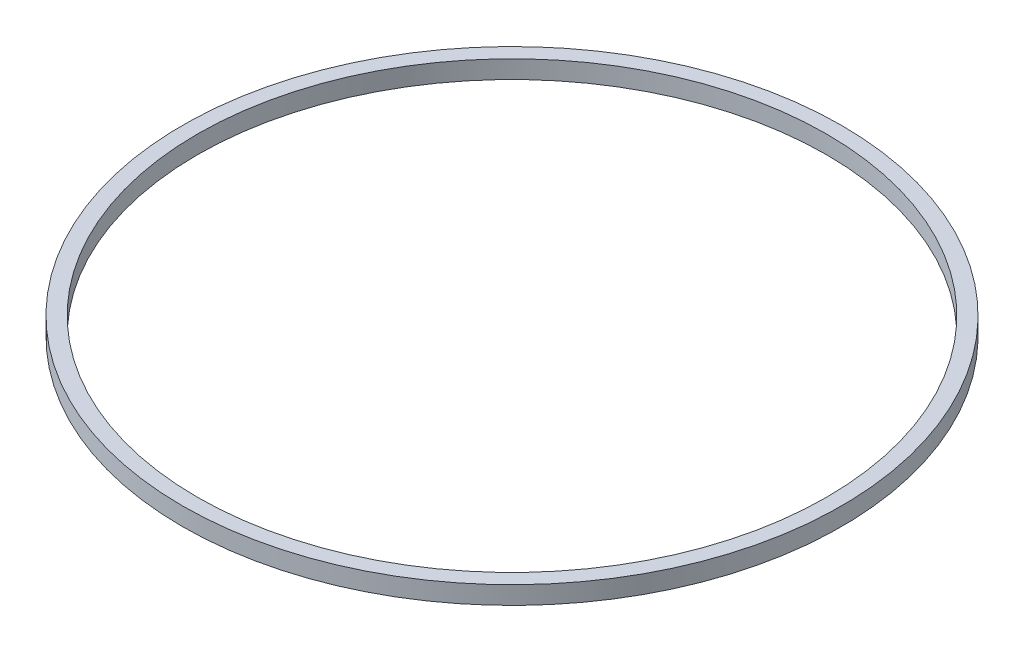
ISO-10303-21;
HEADER;
FILE_DESCRIPTION(('STEP AP214'),'2;1');
FILE_NAME('part.step','',(''),(''),'','','');
FILE_SCHEMA(('AUTOMOTIVE_DESIGN { 1 0 10303 214 1 1 1 1 }'));
ENDSEC;
DATA;
#1=APPLICATION_CONTEXT('core data for automotive mechanical design processes');
#2=APPLICATION_PROTOCOL_DEFINITION('international standard','automotive_design',2000,#1);
#3=PRODUCT_CONTEXT('',#1,'mechanical');
#4=PRODUCT('Part','Part','',(#3));
#5=PRODUCT_RELATED_PRODUCT_CATEGORY('part','',(#4));
#6=PRODUCT_DEFINITION_FORMATION('','',#4);
#7=PRODUCT_DEFINITION_CONTEXT('part definition',#1,'design');
#8=PRODUCT_DEFINITION('design','',#6,#7);
#9=PRODUCT_DEFINITION_SHAPE('','',#8);
#10=(LENGTH_UNIT() NAMED_UNIT(*) SI_UNIT(.MILLI.,.METRE.));
#11=(NAMED_UNIT(*) PLANE_ANGLE_UNIT() SI_UNIT($,.RADIAN.));
#12=(NAMED_UNIT(*) SI_UNIT($,.STERADIAN.) SOLID_ANGLE_UNIT());
#13=UNCERTAINTY_MEASURE_WITH_UNIT(LENGTH_MEASURE(1.E-05),#10,'distance_accuracy_value','');
#14=(GEOMETRIC_REPRESENTATION_CONTEXT(3) GLOBAL_UNCERTAINTY_ASSIGNED_CONTEXT((#13)) GLOBAL_UNIT_ASSIGNED_CONTEXT((#10,
#11,#12)) REPRESENTATION_CONTEXT('',''));
#15=CARTESIAN_POINT('',(0.,0.,0.));
#16=DIRECTION('',(0.,0.,1.));
#17=DIRECTION('',(1.,0.,0.));
#18=AXIS2_PLACEMENT_3D('',#15,#16,#17);
#19=CARTESIAN_POINT('',(0.,17.,0.));
#20=DIRECTION('',(0.,1.,0.));
#21=DIRECTION('',(0.,0.,1.));
#22=AXIS2_PLACEMENT_3D('',#19,#20,#21);
#23=PLANE('',#22);
#24=CARTESIAN_POINT('',(0.,17.,0.));
#25=DIRECTION('',(0.,1.,0.));
#26=DIRECTION('',(0.,0.,1.));
#27=AXIS2_PLACEMENT_3D('',#24,#25,#26);
#28=CIRCLE('',#27,55.);
#29=CARTESIAN_POINT('',(0.,17.,55.));
#30=VERTEX_POINT('',#29);
#31=EDGE_CURVE('E10',#30,#30,#28,.T.);
#32=ORIENTED_EDGE('',*,*,#31,.T.);
#33=EDGE_LOOP('',(#32));
#34=FACE_BOUND('',#33,.T.);
#35=CARTESIAN_POINT('',(0.,17.,0.));
#36=DIRECTION('',(0.,1.,0.));
#37=DIRECTION('',(0.,0.,1.));
#38=AXIS2_PLACEMENT_3D('',#35,#36,#37);
#39=CIRCLE('',#38,52.5);
#40=CARTESIAN_POINT('',(0.,17.,52.5));
#41=VERTEX_POINT('',#40);
#42=EDGE_CURVE('E42',#41,#41,#39,.T.);
#43=ORIENTED_EDGE('',*,*,#42,.F.);
#44=EDGE_LOOP('',(#43));
#45=FACE_BOUND('',#44,.T.);
#46=ADVANCED_FACE('F31',(#34,#45),#23,.T.);
#47=CARTESIAN_POINT('',(0.,14.,0.));
#48=DIRECTION('',(0.,1.,0.));
#49=DIRECTION('',(0.,0.,1.));
#50=AXIS2_PLACEMENT_3D('',#47,#48,#49);
#51=PLANE('',#50);
#52=CARTESIAN_POINT('',(0.,14.,0.));
#53=DIRECTION('',(0.,1.,0.));
#54=DIRECTION('',(0.,0.,1.));
#55=AXIS2_PLACEMENT_3D('',#52,#53,#54);
#56=CIRCLE('',#55,55.);
#57=CARTESIAN_POINT('',(0.,14.,55.));
#58=VERTEX_POINT('',#57);
#59=EDGE_CURVE('E35',#58,#58,#56,.T.);
#60=ORIENTED_EDGE('',*,*,#59,.F.);
#61=EDGE_LOOP('',(#60));
#62=FACE_BOUND('',#61,.T.);
#63=CARTESIAN_POINT('',(0.,14.,0.));
#64=DIRECTION('',(0.,1.,0.));
#65=DIRECTION('',(0.,0.,1.));
#66=AXIS2_PLACEMENT_3D('',#63,#64,#65);
#67=CIRCLE('',#66,52.5);
#68=CARTESIAN_POINT('',(0.,14.,52.5));
#69=VERTEX_POINT('',#68);
#70=EDGE_CURVE('E44',#69,#69,#67,.T.);
#71=ORIENTED_EDGE('',*,*,#70,.T.);
#72=EDGE_LOOP('',(#71));
#73=FACE_BOUND('',#72,.T.);
#74=ADVANCED_FACE('F54',(#62,#73),#51,.F.);
#75=CARTESIAN_POINT('',(0.,17.,0.));
#76=DIRECTION('',(0.,-1.,0.));
#77=DIRECTION('',(0.,0.,-1.));
#78=AXIS2_PLACEMENT_3D('',#75,#76,#77);
#79=CYLINDRICAL_SURFACE('',#78,55.);
#80=ORIENTED_EDGE('',*,*,#31,.F.);
#81=EDGE_LOOP('',(#80));
#82=FACE_BOUND('',#81,.T.);
#83=ORIENTED_EDGE('',*,*,#59,.T.);
#84=EDGE_LOOP('',(#83));
#85=FACE_BOUND('',#84,.T.);
#86=ADVANCED_FACE('F33',(#82,#85),#79,.T.);
#87=CARTESIAN_POINT('',(0.,17.,0.));
#88=DIRECTION('',(0.,-1.,0.));
#89=DIRECTION('',(0.,0.,-1.));
#90=AXIS2_PLACEMENT_3D('',#87,#88,#89);
#91=CYLINDRICAL_SURFACE('',#90,52.5);
#92=ORIENTED_EDGE('',*,*,#42,.T.);
#93=EDGE_LOOP('',(#92));
#94=FACE_BOUND('',#93,.T.);
#95=ORIENTED_EDGE('',*,*,#70,.F.);
#96=EDGE_LOOP('',(#95));
#97=FACE_BOUND('',#96,.T.);
#98=ADVANCED_FACE('F50',(#94,#97),#91,.F.);
#99=CLOSED_SHELL('',(#46,#74,#86,#98));
#100=MANIFOLD_SOLID_BREP('B2',#99);
#101=ADVANCED_BREP_SHAPE_REPRESENTATION('',(#18,#100),#14);
#102=SHAPE_DEFINITION_REPRESENTATION(#9,#101);
ENDSEC;
END-ISO-10303-21;
